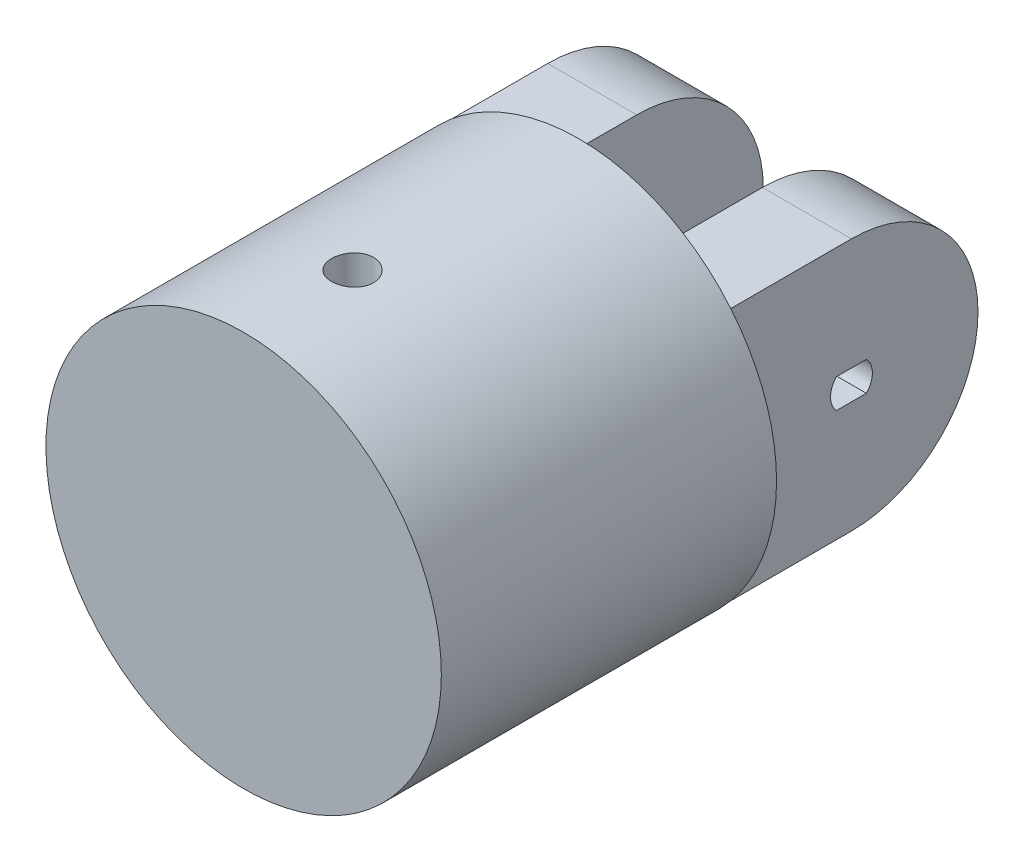
ISO-10303-21;
HEADER;
FILE_DESCRIPTION(('STEP AP214'),'2;1');
FILE_NAME('part.step','',(''),(''),'','','');
FILE_SCHEMA(('AUTOMOTIVE_DESIGN { 1 0 10303 214 1 1 1 1 }'));
ENDSEC;
DATA;
#1=APPLICATION_CONTEXT('core data for automotive mechanical design processes');
#2=APPLICATION_PROTOCOL_DEFINITION('international standard','automotive_design',2000,#1);
#3=PRODUCT_CONTEXT('',#1,'mechanical');
#4=PRODUCT('Part','Part','',(#3));
#5=PRODUCT_RELATED_PRODUCT_CATEGORY('part','',(#4));
#6=PRODUCT_DEFINITION_FORMATION('','',#4);
#7=PRODUCT_DEFINITION_CONTEXT('part definition',#1,'design');
#8=PRODUCT_DEFINITION('design','',#6,#7);
#9=PRODUCT_DEFINITION_SHAPE('','',#8);
#10=(LENGTH_UNIT() NAMED_UNIT(*) SI_UNIT(.MILLI.,.METRE.));
#11=(NAMED_UNIT(*) PLANE_ANGLE_UNIT() SI_UNIT($,.RADIAN.));
#12=(NAMED_UNIT(*) SI_UNIT($,.STERADIAN.) SOLID_ANGLE_UNIT());
#13=UNCERTAINTY_MEASURE_WITH_UNIT(LENGTH_MEASURE(1.E-05),#10,'distance_accuracy_value','');
#14=(GEOMETRIC_REPRESENTATION_CONTEXT(3) GLOBAL_UNCERTAINTY_ASSIGNED_CONTEXT((#13)) GLOBAL_UNIT_ASSIGNED_CONTEXT((#10,
#11,#12)) REPRESENTATION_CONTEXT('',''));
#15=CARTESIAN_POINT('',(0.,0.,0.));
#16=DIRECTION('',(0.,0.,1.));
#17=DIRECTION('',(1.,0.,0.));
#18=AXIS2_PLACEMENT_3D('',#15,#16,#17);
#19=CARTESIAN_POINT('',(7.5,0.,-60.));
#20=DIRECTION('',(1.,0.,0.));
#21=DIRECTION('',(0.,0.,-1.));
#22=AXIS2_PLACEMENT_3D('',#19,#20,#21);
#23=PLANE('',#22);
#24=DIRECTION('',(0.,0.,-1.));
#25=VECTOR('',#24,1.);
#26=CARTESIAN_POINT('',(7.5,-1.75,-60.));
#27=LINE('',#26,#25);
#28=CARTESIAN_POINT('',(7.50000000000001,-1.75,-42.6196428928643));
#29=VERTEX_POINT('',#28);
#30=CARTESIAN_POINT('',(7.5,-1.75,-46.1903571071357));
#31=VERTEX_POINT('',#30);
#32=EDGE_CURVE('E161',#29,#31,#27,.T.);
#33=ORIENTED_EDGE('',*,*,#32,.T.);
#34=CARTESIAN_POINT('',(7.5,0.,-44.405));
#35=DIRECTION('',(1.,0.,0.));
#36=DIRECTION('',(0.,0.,-1.));
#37=AXIS2_PLACEMENT_3D('',#34,#35,#36);
#38=CIRCLE('',#37,2.5);
#39=CARTESIAN_POINT('',(7.50000000000001,1.75,-46.1903571071357));
#40=VERTEX_POINT('',#39);
#41=EDGE_CURVE('E170',#31,#40,#38,.T.);
#42=ORIENTED_EDGE('',*,*,#41,.T.);
#43=DIRECTION('',(0.,0.,1.));
#44=VECTOR('',#43,1.);
#45=CARTESIAN_POINT('',(7.5,1.75,-60.));
#46=LINE('',#45,#44);
#47=CARTESIAN_POINT('',(7.50000000000001,1.75,-42.6196428928643));
#48=VERTEX_POINT('',#47);
#49=EDGE_CURVE('E187',#40,#48,#46,.T.);
#50=ORIENTED_EDGE('',*,*,#49,.T.);
#51=CARTESIAN_POINT('',(7.5,0.,-44.405));
#52=DIRECTION('',(1.,0.,0.));
#53=DIRECTION('',(0.,0.,-1.));
#54=AXIS2_PLACEMENT_3D('',#51,#52,#53);
#55=CIRCLE('',#54,2.5);
#56=EDGE_CURVE('E556',#48,#29,#55,.T.);
#57=ORIENTED_EDGE('',*,*,#56,.T.);
#58=EDGE_LOOP('',(#33,#42,#50,#57));
#59=FACE_BOUND('',#58,.T.);
#60=DIRECTION('',(0.,0.,1.));
#61=VECTOR('',#60,1.);
#62=CARTESIAN_POINT('',(7.5,15.1011299715689,-60.));
#63=LINE('',#62,#61);
#64=CARTESIAN_POINT('',(7.5,15.1011299715689,-44.405));
#65=VERTEX_POINT('',#64);
#66=CARTESIAN_POINT('',(7.5,15.1011299715689,-30.));
#67=VERTEX_POINT('',#66);
#68=EDGE_CURVE('E265',#65,#67,#63,.T.);
#69=ORIENTED_EDGE('',*,*,#68,.F.);
#70=CARTESIAN_POINT('',(7.5,0.,-44.405));
#71=DIRECTION('',(1.,0.,0.));
#72=DIRECTION('',(0.,0.,-1.));
#73=AXIS2_PLACEMENT_3D('',#70,#71,#72);
#74=CIRCLE('',#73,15.1011299715689);
#75=CARTESIAN_POINT('',(7.5,-15.1011299715689,-44.405));
#76=VERTEX_POINT('',#75);
#77=EDGE_CURVE('E208',#65,#76,#74,.F.);
#78=ORIENTED_EDGE('',*,*,#77,.T.);
#79=DIRECTION('',(0.,0.,1.));
#80=VECTOR('',#79,1.);
#81=CARTESIAN_POINT('',(7.5,-15.1011299715689,-60.));
#82=LINE('',#81,#80);
#83=CARTESIAN_POINT('',(7.5,-15.1011299715689,-30.));
#84=VERTEX_POINT('',#83);
#85=EDGE_CURVE('E256',#76,#84,#82,.T.);
#86=ORIENTED_EDGE('',*,*,#85,.T.);
#87=DIRECTION('',(0.,1.,0.));
#88=VECTOR('',#87,1.);
#89=CARTESIAN_POINT('',(7.5,0.,-30.));
#90=LINE('',#89,#88);
#91=EDGE_CURVE('E240',#84,#67,#90,.T.);
#92=ORIENTED_EDGE('',*,*,#91,.T.);
#93=EDGE_LOOP('',(#69,#78,#86,#92));
#94=FACE_BOUND('',#93,.T.);
#95=ADVANCED_FACE('F39',(#59,#94),#23,.F.);
#96=CARTESIAN_POINT('',(18.1230233013641,0.,-60.));
#97=DIRECTION('',(-1.,0.,0.));
#98=DIRECTION('',(0.,0.,1.));
#99=AXIS2_PLACEMENT_3D('',#96,#97,#98);
#100=PLANE('',#99);
#101=DIRECTION('',(0.,0.,-1.));
#102=VECTOR('',#101,1.);
#103=CARTESIAN_POINT('',(18.1230233013641,1.75,-60.));
#104=LINE('',#103,#102);
#105=CARTESIAN_POINT('',(18.1230233013641,1.75,-42.6196428928643));
#106=VERTEX_POINT('',#105);
#107=CARTESIAN_POINT('',(18.1230233013641,1.75,-46.1903571071357));
#108=VERTEX_POINT('',#107);
#109=EDGE_CURVE('E179',#106,#108,#104,.T.);
#110=ORIENTED_EDGE('',*,*,#109,.T.);
#111=CARTESIAN_POINT('',(18.1230233013641,0.,-44.405));
#112=DIRECTION('',(-1.,0.,0.));
#113=DIRECTION('',(0.,0.,1.));
#114=AXIS2_PLACEMENT_3D('',#111,#112,#113);
#115=CIRCLE('',#114,2.5);
#116=CARTESIAN_POINT('',(18.1230233013641,-1.75,-46.1903571071357));
#117=VERTEX_POINT('',#116);
#118=EDGE_CURVE('E167',#108,#117,#115,.T.);
#119=ORIENTED_EDGE('',*,*,#118,.T.);
#120=DIRECTION('',(0.,0.,1.));
#121=VECTOR('',#120,1.);
#122=CARTESIAN_POINT('',(18.1230233013641,-1.75,-60.));
#123=LINE('',#122,#121);
#124=CARTESIAN_POINT('',(18.1230233013641,-1.75,-42.6196428928643));
#125=VERTEX_POINT('',#124);
#126=EDGE_CURVE('E155',#117,#125,#123,.T.);
#127=ORIENTED_EDGE('',*,*,#126,.T.);
#128=CARTESIAN_POINT('',(18.1230233013641,0.,-44.405));
#129=DIRECTION('',(-1.,0.,0.));
#130=DIRECTION('',(0.,0.,1.));
#131=AXIS2_PLACEMENT_3D('',#128,#129,#130);
#132=CIRCLE('',#131,2.5);
#133=EDGE_CURVE('E554',#125,#106,#132,.T.);
#134=ORIENTED_EDGE('',*,*,#133,.T.);
#135=EDGE_LOOP('',(#110,#119,#127,#134));
#136=FACE_BOUND('',#135,.T.);
#137=DIRECTION('',(0.,0.,1.));
#138=VECTOR('',#137,1.);
#139=CARTESIAN_POINT('',(18.1230233013641,-15.1011299715689,-60.));
#140=LINE('',#139,#138);
#141=CARTESIAN_POINT('',(18.1230233013641,-15.1011299715689,-44.405));
#142=VERTEX_POINT('',#141);
#143=CARTESIAN_POINT('',(18.1230233013641,-15.1011299715689,-30.));
#144=VERTEX_POINT('',#143);
#145=EDGE_CURVE('E259',#142,#144,#140,.T.);
#146=ORIENTED_EDGE('',*,*,#145,.F.);
#147=CARTESIAN_POINT('',(18.1230233013641,0.,-44.405));
#148=DIRECTION('',(-1.,0.,0.));
#149=DIRECTION('',(0.,0.,1.));
#150=AXIS2_PLACEMENT_3D('',#147,#148,#149);
#151=CIRCLE('',#150,15.1011299715689);
#152=CARTESIAN_POINT('',(18.1230233013641,15.1011299715689,-44.405));
#153=VERTEX_POINT('',#152);
#154=EDGE_CURVE('E204',#142,#153,#151,.F.);
#155=ORIENTED_EDGE('',*,*,#154,.T.);
#156=DIRECTION('',(0.,0.,1.));
#157=VECTOR('',#156,1.);
#158=CARTESIAN_POINT('',(18.1230233013641,15.1011299715689,-60.));
#159=LINE('',#158,#157);
#160=CARTESIAN_POINT('',(18.1230233013641,15.1011299715689,-30.));
#161=VERTEX_POINT('',#160);
#162=EDGE_CURVE('E262',#153,#161,#159,.T.);
#163=ORIENTED_EDGE('',*,*,#162,.T.);
#164=DIRECTION('',(0.,-1.,0.));
#165=VECTOR('',#164,1.);
#166=CARTESIAN_POINT('',(18.1230233013641,0.,-30.));
#167=LINE('',#166,#165);
#168=EDGE_CURVE('E248',#161,#144,#167,.T.);
#169=ORIENTED_EDGE('',*,*,#168,.T.);
#170=EDGE_LOOP('',(#146,#155,#163,#169));
#171=FACE_BOUND('',#170,.T.);
#172=ADVANCED_FACE('F177',(#136,#171),#100,.F.);
#173=CARTESIAN_POINT('',(-7.5,0.,-60.));
#174=DIRECTION('',(1.,0.,0.));
#175=DIRECTION('',(0.,0.,-1.));
#176=AXIS2_PLACEMENT_3D('',#173,#174,#175);
#177=PLANE('',#176);
#178=CARTESIAN_POINT('',(-7.50000000000001,0.,-44.405));
#179=DIRECTION('',(1.,0.,0.));
#180=DIRECTION('',(0.,0.,-1.));
#181=AXIS2_PLACEMENT_3D('',#178,#179,#180);
#182=CIRCLE('',#181,2.5);
#183=CARTESIAN_POINT('',(-7.49999999999998,-1.75,-46.1903571071357));
#184=VERTEX_POINT('',#183);
#185=CARTESIAN_POINT('',(-7.49999999999998,1.75,-46.1903571071357));
#186=VERTEX_POINT('',#185);
#187=EDGE_CURVE('E181',#184,#186,#182,.T.);
#188=ORIENTED_EDGE('',*,*,#187,.F.);
#189=DIRECTION('',(0.,0.,-1.));
#190=VECTOR('',#189,1.);
#191=CARTESIAN_POINT('',(-7.5,-1.75,-60.));
#192=LINE('',#191,#190);
#193=CARTESIAN_POINT('',(-7.5,-1.75,-42.6196428928643));
#194=VERTEX_POINT('',#193);
#195=EDGE_CURVE('E162',#194,#184,#192,.T.);
#196=ORIENTED_EDGE('',*,*,#195,.F.);
#197=CARTESIAN_POINT('',(-7.50000000000001,0.,-44.405));
#198=DIRECTION('',(1.,0.,0.));
#199=DIRECTION('',(0.,0.,-1.));
#200=AXIS2_PLACEMENT_3D('',#197,#198,#199);
#201=CIRCLE('',#200,2.5);
#202=CARTESIAN_POINT('',(-7.49999999999998,1.75,-42.6196428928643));
#203=VERTEX_POINT('',#202);
#204=EDGE_CURVE('E563',#203,#194,#201,.T.);
#205=ORIENTED_EDGE('',*,*,#204,.F.);
#206=DIRECTION('',(0.,0.,1.));
#207=VECTOR('',#206,1.);
#208=CARTESIAN_POINT('',(-7.5,1.75,-60.));
#209=LINE('',#208,#207);
#210=EDGE_CURVE('E567',#186,#203,#209,.T.);
#211=ORIENTED_EDGE('',*,*,#210,.F.);
#212=EDGE_LOOP('',(#188,#196,#205,#211));
#213=FACE_BOUND('',#212,.T.);
#214=CARTESIAN_POINT('',(-7.5,0.,-44.405));
#215=DIRECTION('',(1.,0.,0.));
#216=DIRECTION('',(0.,0.,-1.));
#217=AXIS2_PLACEMENT_3D('',#214,#215,#216);
#218=CIRCLE('',#217,15.1011299715689);
#219=CARTESIAN_POINT('',(-7.5,15.1011299715689,-44.405));
#220=VERTEX_POINT('',#219);
#221=CARTESIAN_POINT('',(-7.5,-15.1011299715689,-44.405));
#222=VERTEX_POINT('',#221);
#223=EDGE_CURVE('E201',#220,#222,#218,.F.);
#224=ORIENTED_EDGE('',*,*,#223,.F.);
#225=DIRECTION('',(0.,0.,1.));
#226=VECTOR('',#225,1.);
#227=CARTESIAN_POINT('',(-7.5,15.1011299715689,-60.));
#228=LINE('',#227,#226);
#229=CARTESIAN_POINT('',(-7.5,15.1011299715689,-30.));
#230=VERTEX_POINT('',#229);
#231=EDGE_CURVE('E228',#220,#230,#228,.T.);
#232=ORIENTED_EDGE('',*,*,#231,.T.);
#233=DIRECTION('',(0.,1.,0.));
#234=VECTOR('',#233,1.);
#235=CARTESIAN_POINT('',(-7.5,0.,-30.));
#236=LINE('',#235,#234);
#237=CARTESIAN_POINT('',(-7.5,-15.1011299715689,-30.));
#238=VERTEX_POINT('',#237);
#239=EDGE_CURVE('E212',#238,#230,#236,.T.);
#240=ORIENTED_EDGE('',*,*,#239,.F.);
#241=DIRECTION('',(0.,0.,1.));
#242=VECTOR('',#241,1.);
#243=CARTESIAN_POINT('',(-7.5,-15.1011299715689,-60.));
#244=LINE('',#243,#242);
#245=EDGE_CURVE('E237',#222,#238,#244,.T.);
#246=ORIENTED_EDGE('',*,*,#245,.F.);
#247=EDGE_LOOP('',(#224,#232,#240,#246));
#248=FACE_BOUND('',#247,.T.);
#249=ADVANCED_FACE('F337',(#213,#248),#177,.T.);
#250=CARTESIAN_POINT('',(-18.1230233013641,0.,-60.));
#251=DIRECTION('',(-1.,0.,0.));
#252=DIRECTION('',(0.,0.,1.));
#253=AXIS2_PLACEMENT_3D('',#250,#251,#252);
#254=PLANE('',#253);
#255=CARTESIAN_POINT('',(-18.1230233013641,0.,-44.405));
#256=DIRECTION('',(-1.,0.,0.));
#257=DIRECTION('',(0.,0.,1.));
#258=AXIS2_PLACEMENT_3D('',#255,#256,#257);
#259=CIRCLE('',#258,2.5);
#260=CARTESIAN_POINT('',(-18.123023301364,1.75,-46.1903571071357));
#261=VERTEX_POINT('',#260);
#262=CARTESIAN_POINT('',(-18.1230233013641,-1.75,-46.1903571071357));
#263=VERTEX_POINT('',#262);
#264=EDGE_CURVE('E291',#261,#263,#259,.T.);
#265=ORIENTED_EDGE('',*,*,#264,.F.);
#266=DIRECTION('',(0.,0.,-1.));
#267=VECTOR('',#266,1.);
#268=CARTESIAN_POINT('',(-18.1230233013641,1.75,-60.));
#269=LINE('',#268,#267);
#270=CARTESIAN_POINT('',(-18.123023301364,1.75,-42.6196428928643));
#271=VERTEX_POINT('',#270);
#272=EDGE_CURVE('E288',#271,#261,#269,.T.);
#273=ORIENTED_EDGE('',*,*,#272,.F.);
#274=CARTESIAN_POINT('',(-18.1230233013641,0.,-44.405));
#275=DIRECTION('',(-1.,0.,0.));
#276=DIRECTION('',(0.,0.,1.));
#277=AXIS2_PLACEMENT_3D('',#274,#275,#276);
#278=CIRCLE('',#277,2.5);
#279=CARTESIAN_POINT('',(-18.123023301364,-1.75,-42.6196428928643));
#280=VERTEX_POINT('',#279);
#281=EDGE_CURVE('E285',#280,#271,#278,.T.);
#282=ORIENTED_EDGE('',*,*,#281,.F.);
#283=DIRECTION('',(0.,0.,1.));
#284=VECTOR('',#283,1.);
#285=CARTESIAN_POINT('',(-18.1230233013641,-1.75,-60.));
#286=LINE('',#285,#284);
#287=EDGE_CURVE('E282',#263,#280,#286,.T.);
#288=ORIENTED_EDGE('',*,*,#287,.F.);
#289=EDGE_LOOP('',(#265,#273,#282,#288));
#290=FACE_BOUND('',#289,.T.);
#291=CARTESIAN_POINT('',(-18.1230233013641,0.,-44.405));
#292=DIRECTION('',(-1.,0.,0.));
#293=DIRECTION('',(0.,0.,1.));
#294=AXIS2_PLACEMENT_3D('',#291,#292,#293);
#295=CIRCLE('',#294,15.1011299715689);
#296=CARTESIAN_POINT('',(-18.1230233013641,-15.1011299715689,-44.405));
#297=VERTEX_POINT('',#296);
#298=CARTESIAN_POINT('',(-18.1230233013641,15.1011299715689,-44.405));
#299=VERTEX_POINT('',#298);
#300=EDGE_CURVE('E198',#297,#299,#295,.F.);
#301=ORIENTED_EDGE('',*,*,#300,.F.);
#302=DIRECTION('',(0.,0.,1.));
#303=VECTOR('',#302,1.);
#304=CARTESIAN_POINT('',(-18.1230233013641,-15.1011299715689,-60.));
#305=LINE('',#304,#303);
#306=CARTESIAN_POINT('',(-18.1230233013641,-15.1011299715689,-30.));
#307=VERTEX_POINT('',#306);
#308=EDGE_CURVE('E234',#297,#307,#305,.T.);
#309=ORIENTED_EDGE('',*,*,#308,.T.);
#310=DIRECTION('',(0.,-1.,0.));
#311=VECTOR('',#310,1.);
#312=CARTESIAN_POINT('',(-18.1230233013641,0.,-30.));
#313=LINE('',#312,#311);
#314=CARTESIAN_POINT('',(-18.1230233013641,15.1011299715689,-30.));
#315=VERTEX_POINT('',#314);
#316=EDGE_CURVE('E220',#315,#307,#313,.T.);
#317=ORIENTED_EDGE('',*,*,#316,.F.);
#318=DIRECTION('',(0.,0.,1.));
#319=VECTOR('',#318,1.);
#320=CARTESIAN_POINT('',(-18.1230233013641,15.1011299715689,-60.));
#321=LINE('',#320,#319);
#322=EDGE_CURVE('E231',#299,#315,#321,.T.);
#323=ORIENTED_EDGE('',*,*,#322,.F.);
#324=EDGE_LOOP('',(#301,#309,#317,#323));
#325=FACE_BOUND('',#324,.T.);
#326=ADVANCED_FACE('F333',(#290,#325),#254,.T.);
#327=CARTESIAN_POINT('',(0.,0.,-30.));
#328=DIRECTION('',(0.,0.,1.));
#329=DIRECTION('',(1.,0.,0.));
#330=AXIS2_PLACEMENT_3D('',#327,#328,#329);
#331=PLANE('',#330);
#332=DIRECTION('',(1.,0.,0.));
#333=VECTOR('',#332,1.);
#334=CARTESIAN_POINT('',(0.,-15.1011299715689,-30.));
#335=LINE('',#334,#333);
#336=EDGE_CURVE('E216',#307,#238,#335,.T.);
#337=ORIENTED_EDGE('',*,*,#336,.T.);
#338=ORIENTED_EDGE('',*,*,#239,.T.);
#339=DIRECTION('',(-1.,0.,0.));
#340=VECTOR('',#339,1.);
#341=CARTESIAN_POINT('',(0.,15.1011299715689,-30.));
#342=LINE('',#341,#340);
#343=EDGE_CURVE('E224',#230,#315,#342,.T.);
#344=ORIENTED_EDGE('',*,*,#343,.T.);
#345=CARTESIAN_POINT('',(0.,0.,-30.));
#346=DIRECTION('',(0.,0.,1.));
#347=DIRECTION('',(1.,0.,0.));
#348=AXIS2_PLACEMENT_3D('',#345,#346,#347);
#349=CIRCLE('',#348,23.59);
#350=EDGE_CURVE('E269',#161,#315,#349,.T.);
#351=ORIENTED_EDGE('',*,*,#350,.F.);
#352=DIRECTION('',(1.,0.,0.));
#353=VECTOR('',#352,1.);
#354=CARTESIAN_POINT('',(0.,15.1011299715689,-30.));
#355=LINE('',#354,#353);
#356=EDGE_CURVE('E244',#67,#161,#355,.T.);
#357=ORIENTED_EDGE('',*,*,#356,.F.);
#358=ORIENTED_EDGE('',*,*,#91,.F.);
#359=DIRECTION('',(-1.,0.,0.));
#360=VECTOR('',#359,1.);
#361=CARTESIAN_POINT('',(0.,-15.1011299715689,-30.));
#362=LINE('',#361,#360);
#363=EDGE_CURVE('E252',#144,#84,#362,.T.);
#364=ORIENTED_EDGE('',*,*,#363,.F.);
#365=EDGE_CURVE('E275',#307,#144,#349,.T.);
#366=ORIENTED_EDGE('',*,*,#365,.F.);
#367=EDGE_LOOP('',(#337,#338,#344,#351,#357,#358,#364,#366));
#368=FACE_BOUND('',#367,.T.);
#369=ADVANCED_FACE('F336',(#368),#331,.F.);
#370=EDGE_CURVE('E274',#315,#307,#349,.T.);
#371=ORIENTED_EDGE('',*,*,#370,.F.);
#372=ORIENTED_EDGE('',*,*,#316,.T.);
#373=EDGE_LOOP('',(#371,#372));
#374=FACE_BOUND('',#373,.T.);
#375=ADVANCED_FACE('F359',(#374),#331,.F.);
#376=ORIENTED_EDGE('',*,*,#168,.F.);
#377=EDGE_CURVE('E268',#144,#161,#349,.T.);
#378=ORIENTED_EDGE('',*,*,#377,.F.);
#379=EDGE_LOOP('',(#376,#378));
#380=FACE_BOUND('',#379,.T.);
#381=ADVANCED_FACE('F361',(#380),#331,.F.);
#382=CARTESIAN_POINT('',(0.,0.,10.));
#383=DIRECTION('',(0.,0.,-1.));
#384=DIRECTION('',(-1.,0.,0.));
#385=AXIS2_PLACEMENT_3D('',#382,#383,#384);
#386=CYLINDRICAL_SURFACE('',#385,23.59);
#387=CARTESIAN_POINT('',(0.,-23.59,-0.489999999999999));
#388=CARTESIAN_POINT('',(0.140004890382727,-23.5899983030771,-0.49000603969693));
#389=CARTESIAN_POINT('',(0.280101235515981,-23.5887403958274,-0.501800431214244));
#390=CARTESIAN_POINT('',(0.556406756116709,-23.5838433207523,-0.548670742691896));
#391=CARTESIAN_POINT('',(0.69261152926387,-23.5802015594957,-0.583772019164651));
#392=CARTESIAN_POINT('',(0.957092956934866,-23.5709476853588,-0.676220022695312));
#393=CARTESIAN_POINT('',(1.0853744636063,-23.5653367927148,-0.733552975473993));
#394=CARTESIAN_POINT('',(1.33046665616082,-23.552771315274,-0.868809341570436));
#395=CARTESIAN_POINT('',(1.447279548038,-23.545816989654,-0.946728784381125));
#396=CARTESIAN_POINT('',(1.66661511804326,-23.5313118555805,-1.12128191983053));
#397=CARTESIAN_POINT('',(1.76908519934517,-23.5237590029897,-1.2179815397044));
#398=CARTESIAN_POINT('',(1.95637410950071,-23.5089248770597,-1.42720917965773));
#399=CARTESIAN_POINT('',(2.04119210452785,-23.501643616563,-1.53973794703344));
#400=CARTESIAN_POINT('',(2.19095784039705,-23.4881564147091,-1.77776192131046));
#401=CARTESIAN_POINT('',(2.25585757467481,-23.4819530867172,-1.90328749494447));
#402=CARTESIAN_POINT('',(2.36363798842801,-23.4713498936534,-2.16353171314162));
#403=CARTESIAN_POINT('',(2.40651927501024,-23.4669499788572,-2.29825010411844));
#404=CARTESIAN_POINT('',(2.46888865123076,-23.4604705499611,-2.57251690153356));
#405=CARTESIAN_POINT('',(2.48846438567586,-23.4583823443468,-2.71204516838282));
#406=CARTESIAN_POINT('',(2.50393796281383,-23.4567358887997,-2.99242118420334));
#407=CARTESIAN_POINT('',(2.49983649980298,-23.4571775646821,-3.13326889436311));
#408=CARTESIAN_POINT('',(2.46814427950293,-23.4605330256352,-3.41168003730262));
#409=CARTESIAN_POINT('',(2.44064940226408,-23.4634367197315,-3.54925452309887));
#410=CARTESIAN_POINT('',(2.3631001092226,-23.4713732901132,-3.81782537038899));
#411=CARTESIAN_POINT('',(2.31304535499427,-23.4764061983395,-3.94882163316874));
#412=CARTESIAN_POINT('',(2.19169195639642,-23.4880456955699,-4.20081931310333));
#413=CARTESIAN_POINT('',(2.12035096524796,-23.4946554161757,-4.32180018698026));
#414=CARTESIAN_POINT('',(1.95848059921139,-23.5087011989002,-4.55010801848893));
#415=CARTESIAN_POINT('',(1.86795059325973,-23.5161372881916,-4.65743452688772));
#416=CARTESIAN_POINT('',(1.66973740575721,-23.5310428996824,-4.85594403960406));
#417=CARTESIAN_POINT('',(1.56197145460676,-23.538512404975,-4.94704441956521));
#418=CARTESIAN_POINT('',(1.3326323311139,-23.5526085089759,-5.10987462840384));
#419=CARTESIAN_POINT('',(1.21105914024982,-23.5592351065534,-5.18160443129632));
#420=CARTESIAN_POINT('',(0.95749788958243,-23.5709013286536,-5.30365476311559));
#421=CARTESIAN_POINT('',(0.825507692564154,-23.5759406264525,-5.35397088507729));
#422=CARTESIAN_POINT('',(0.554887088841686,-23.583861220576,-5.43170391119958));
#423=CARTESIAN_POINT('',(0.416256905405359,-23.5867425894063,-5.45912158474396));
#424=CARTESIAN_POINT('',(0.137006812514261,-23.5900133370954,-5.49017411128186));
#425=CARTESIAN_POINT('',(-0.00360028917354425,-23.5904146578676,-5.49392293627816));
#426=CARTESIAN_POINT('',(-0.283440751422993,-23.5887121615328,-5.47783100808127));
#427=CARTESIAN_POINT('',(-0.422674132839351,-23.5866083825154,-5.45799061355793));
#428=CARTESIAN_POINT('',(-0.695484265843108,-23.5801396699159,-5.39537802601103));
#429=CARTESIAN_POINT('',(-0.82907345030202,-23.5757800202398,-5.3526594122884));
#430=CARTESIAN_POINT('',(-1.08719009199438,-23.5652884237549,-5.24555821321705));
#431=CARTESIAN_POINT('',(-1.21171732245822,-23.5591564326133,-5.18117508595433));
#432=CARTESIAN_POINT('',(-1.44868911728913,-23.5457757711934,-5.0322913247812));
#433=CARTESIAN_POINT('',(-1.5610865587743,-23.5385229945229,-4.94771606251431));
#434=CARTESIAN_POINT('',(-1.77013069103516,-23.52372718167,-4.76095550181403));
#435=CARTESIAN_POINT('',(-1.86677693664698,-23.5161841372913,-4.6587697058356));
#436=CARTESIAN_POINT('',(-2.04197287593517,-23.5016218005983,-4.43919039930669));
#437=CARTESIAN_POINT('',(-2.12044760211723,-23.4946047560305,-4.32173690413937));
#438=CARTESIAN_POINT('',(-2.25655697915346,-23.4819237546767,-4.07525107588106));
#439=CARTESIAN_POINT('',(-2.31419194505344,-23.4762597774361,-3.94621891786773));
#440=CARTESIAN_POINT('',(-2.40686115244347,-23.4669405565708,-3.68049226779922));
#441=CARTESIAN_POINT('',(-2.44193948508609,-23.4632813962425,-3.54381329513695));
#442=CARTESIAN_POINT('',(-2.48864252138218,-23.4583741704025,-3.26646441598402));
#443=CARTESIAN_POINT('',(-2.50026798822697,-23.4571260264327,-3.12579463951115));
#444=CARTESIAN_POINT('',(-2.49972395442829,-23.4571839502349,-2.8452024982952));
#445=CARTESIAN_POINT('',(-2.48767221595611,-23.4584773771247,-2.70527988777961));
#446=CARTESIAN_POINT('',(-2.44036333007009,-23.4634457046064,-2.42945940858843));
#447=CARTESIAN_POINT('',(-2.40510616101156,-23.4671206074198,-2.293561543667));
#448=CARTESIAN_POINT('',(-2.31242071265327,-23.4764342239078,-2.02965235169496));
#449=CARTESIAN_POINT('',(-2.25499638901096,-23.4820725871918,-1.90163962229053));
#450=CARTESIAN_POINT('',(-2.11961864177243,-23.4946785069669,-1.65705012653464));
#451=CARTESIAN_POINT('',(-2.04166525062717,-23.5016460613569,-1.54047334210642));
#452=CARTESIAN_POINT('',(-1.86700081845346,-23.5161668347073,-1.32146155094034));
#453=CARTESIAN_POINT('',(-1.77020196065382,-23.5237226921116,-1.21909675155487));
#454=CARTESIAN_POINT('',(-1.56077124206543,-23.538544757639,-1.03201366539061));
#455=CARTESIAN_POINT('',(-1.44813560849441,-23.5458108962116,-0.947299595500965));
#456=CARTESIAN_POINT('',(-1.20987998501282,-23.5592562744924,-0.797732482694004));
#457=CARTESIAN_POINT('',(-1.08422463280158,-23.5654324240323,-0.732935532387384));
#458=CARTESIAN_POINT('',(-0.823829412681912,-23.5759690180188,-0.625448967407829));
#459=CARTESIAN_POINT('',(-0.689099898452414,-23.5803314924243,-0.582734623623249));
#460=CARTESIAN_POINT('',(-0.461351179347137,-23.5856627304559,-0.531183987042706));
#461=CARTESIAN_POINT('',(-0.369783882248669,-23.5872815484788,-0.515761329659117));
#462=CARTESIAN_POINT('',(-0.185491103341336,-23.5894507428818,-0.495167359685417));
#463=CARTESIAN_POINT('',(-0.0927656270625256,-23.5900011243616,-0.489995998166409));
#464=CARTESIAN_POINT('',(0.,-23.59,-0.489999999999999));
#465=B_SPLINE_CURVE_WITH_KNOTS('',3,(#387,#388,#389,#390,#391,#392,#393,#394,#395,#396,#397,
#398,#399,#400,#401,#402,#403,#404,#405,#406,#407,#408,#409,#410,#411,#412,#413,#414,#415,#416,
#417,#418,#419,#420,#421,#422,#423,#424,#425,#426,#427,#428,#429,#430,#431,#432,#433,#434,#435,
#436,#437,#438,#439,#440,#441,#442,#443,#444,#445,#446,#447,#448,#449,#450,#451,#452,#453,#454,
#455,#456,#457,#458,#459,#460,#461,#462,#463,#464),.UNSPECIFIED.,.T.,.F.,(4,2,2,2,2,2,2,2,2,2,2,
2,2,2,2,2,2,2,2,2,2,2,2,2,2,2,2,2,2,2,2,2,2,2,2,2,2,2,4),(0.,0.41967590487986,0.839809142071956,
1.25968248839799,1.67947491298238,2.10076854982229,2.52208208267318,2.94440322328858,
3.36671271876888,3.78742897392592,4.2081328923083,4.62712077768863,5.04611494860777,
5.46594828694184,5.88579543435547,6.30772288072299,6.72965089308984,7.15166569688249,
7.57366632048222,7.99363333555401,8.41359396518424,8.8325753478515,9.25156721165667,
9.67213228156076,10.0927092355103,10.5149915581614,10.9372674966777,11.3587154885586,
11.7801497656706,12.1994932813853,12.6188371882399,13.0381062990891,13.4573747471904,
13.878645816124,14.3000174147048,14.7225650736196,15.1446385137549,15.4227122595514,
15.7007846781132),.UNSPECIFIED.);
#466=CARTESIAN_POINT('',(0.,-23.59,-0.489999999999999));
#467=VERTEX_POINT('',#466);
#468=EDGE_CURVE('E11',#467,#467,#465,.T.);
#469=ORIENTED_EDGE('',*,*,#468,.T.);
#470=EDGE_LOOP('',(#469));
#471=FACE_BOUND('',#470,.T.);
#472=CARTESIAN_POINT('',(0.,23.59,-0.489999999999999));
#473=CARTESIAN_POINT('',(-0.140004890382727,23.5899983030771,-0.49000603969693));
#474=CARTESIAN_POINT('',(-0.280101235515981,23.5887403958274,-0.501800431214244));
#475=CARTESIAN_POINT('',(-0.556406756116709,23.5838433207523,-0.548670742691896));
#476=CARTESIAN_POINT('',(-0.69261152926387,23.5802015594957,-0.583772019164651));
#477=CARTESIAN_POINT('',(-0.957092956934866,23.5709476853588,-0.676220022695312));
#478=CARTESIAN_POINT('',(-1.0853744636063,23.5653367927148,-0.733552975473993));
#479=CARTESIAN_POINT('',(-1.33046665616082,23.552771315274,-0.868809341570436));
#480=CARTESIAN_POINT('',(-1.447279548038,23.545816989654,-0.946728784381125));
#481=CARTESIAN_POINT('',(-1.66661511804326,23.5313118555805,-1.12128191983053));
#482=CARTESIAN_POINT('',(-1.76908519934517,23.5237590029897,-1.2179815397044));
#483=CARTESIAN_POINT('',(-1.95637410950071,23.5089248770597,-1.42720917965773));
#484=CARTESIAN_POINT('',(-2.04119210452785,23.501643616563,-1.53973794703344));
#485=CARTESIAN_POINT('',(-2.19095784039705,23.4881564147091,-1.77776192131046));
#486=CARTESIAN_POINT('',(-2.25585757467481,23.4819530867172,-1.90328749494447));
#487=CARTESIAN_POINT('',(-2.36363798842801,23.4713498936534,-2.16353171314162));
#488=CARTESIAN_POINT('',(-2.40651927501024,23.4669499788572,-2.29825010411844));
#489=CARTESIAN_POINT('',(-2.46888865123076,23.4604705499611,-2.57251690153356));
#490=CARTESIAN_POINT('',(-2.48846438567586,23.4583823443468,-2.71204516838282));
#491=CARTESIAN_POINT('',(-2.50393796281383,23.4567358887997,-2.99242118420334));
#492=CARTESIAN_POINT('',(-2.49983649980298,23.4571775646821,-3.13326889436311));
#493=CARTESIAN_POINT('',(-2.46814427950293,23.4605330256352,-3.41168003730262));
#494=CARTESIAN_POINT('',(-2.44064940226408,23.4634367197315,-3.54925452309887));
#495=CARTESIAN_POINT('',(-2.3631001092226,23.4713732901132,-3.81782537038899));
#496=CARTESIAN_POINT('',(-2.31304535499427,23.4764061983395,-3.94882163316874));
#497=CARTESIAN_POINT('',(-2.19169195639642,23.4880456955699,-4.20081931310333));
#498=CARTESIAN_POINT('',(-2.12035096524796,23.4946554161757,-4.32180018698026));
#499=CARTESIAN_POINT('',(-1.95848059921139,23.5087011989002,-4.55010801848893));
#500=CARTESIAN_POINT('',(-1.86795059325973,23.5161372881916,-4.65743452688772));
#501=CARTESIAN_POINT('',(-1.66973740575721,23.5310428996824,-4.85594403960406));
#502=CARTESIAN_POINT('',(-1.56197145460676,23.538512404975,-4.94704441956521));
#503=CARTESIAN_POINT('',(-1.3326323311139,23.5526085089759,-5.10987462840384));
#504=CARTESIAN_POINT('',(-1.21105914024982,23.5592351065534,-5.18160443129632));
#505=CARTESIAN_POINT('',(-0.95749788958243,23.5709013286536,-5.30365476311559));
#506=CARTESIAN_POINT('',(-0.825507692564154,23.5759406264525,-5.35397088507729));
#507=CARTESIAN_POINT('',(-0.554887088841686,23.583861220576,-5.43170391119958));
#508=CARTESIAN_POINT('',(-0.416256905405359,23.5867425894063,-5.45912158474396));
#509=CARTESIAN_POINT('',(-0.137006812514261,23.5900133370954,-5.49017411128186));
#510=CARTESIAN_POINT('',(0.00360028917354425,23.5904146578676,-5.49392293627816));
#511=CARTESIAN_POINT('',(0.283440751422993,23.5887121615328,-5.47783100808127));
#512=CARTESIAN_POINT('',(0.422674132839351,23.5866083825154,-5.45799061355793));
#513=CARTESIAN_POINT('',(0.695484265843108,23.5801396699159,-5.39537802601103));
#514=CARTESIAN_POINT('',(0.82907345030202,23.5757800202398,-5.3526594122884));
#515=CARTESIAN_POINT('',(1.08719009199438,23.5652884237549,-5.24555821321705));
#516=CARTESIAN_POINT('',(1.21171732245822,23.5591564326133,-5.18117508595433));
#517=CARTESIAN_POINT('',(1.44868911728913,23.5457757711934,-5.0322913247812));
#518=CARTESIAN_POINT('',(1.5610865587743,23.5385229945229,-4.94771606251431));
#519=CARTESIAN_POINT('',(1.77013069103516,23.52372718167,-4.76095550181403));
#520=CARTESIAN_POINT('',(1.86677693664698,23.5161841372913,-4.6587697058356));
#521=CARTESIAN_POINT('',(2.04197287593517,23.5016218005983,-4.43919039930669));
#522=CARTESIAN_POINT('',(2.12044760211723,23.4946047560305,-4.32173690413937));
#523=CARTESIAN_POINT('',(2.25655697915346,23.4819237546767,-4.07525107588106));
#524=CARTESIAN_POINT('',(2.31419194505344,23.4762597774361,-3.94621891786773));
#525=CARTESIAN_POINT('',(2.40686115244347,23.4669405565708,-3.68049226779922));
#526=CARTESIAN_POINT('',(2.44193948508609,23.4632813962425,-3.54381329513695));
#527=CARTESIAN_POINT('',(2.48864252138218,23.4583741704025,-3.26646441598402));
#528=CARTESIAN_POINT('',(2.50026798822697,23.4571260264327,-3.12579463951115));
#529=CARTESIAN_POINT('',(2.49972395442829,23.4571839502349,-2.8452024982952));
#530=CARTESIAN_POINT('',(2.48767221595611,23.4584773771247,-2.70527988777961));
#531=CARTESIAN_POINT('',(2.44036333007009,23.4634457046064,-2.42945940858843));
#532=CARTESIAN_POINT('',(2.40510616101156,23.4671206074198,-2.293561543667));
#533=CARTESIAN_POINT('',(2.31242071265327,23.4764342239078,-2.02965235169496));
#534=CARTESIAN_POINT('',(2.25499638901096,23.4820725871918,-1.90163962229053));
#535=CARTESIAN_POINT('',(2.11961864177243,23.4946785069669,-1.65705012653464));
#536=CARTESIAN_POINT('',(2.04166525062717,23.5016460613569,-1.54047334210642));
#537=CARTESIAN_POINT('',(1.86700081845346,23.5161668347073,-1.32146155094034));
#538=CARTESIAN_POINT('',(1.77020196065382,23.5237226921116,-1.21909675155487));
#539=CARTESIAN_POINT('',(1.56077124206543,23.538544757639,-1.03201366539061));
#540=CARTESIAN_POINT('',(1.44813560849441,23.5458108962116,-0.947299595500965));
#541=CARTESIAN_POINT('',(1.20987998501282,23.5592562744924,-0.797732482694004));
#542=CARTESIAN_POINT('',(1.08422463280158,23.5654324240323,-0.732935532387384));
#543=CARTESIAN_POINT('',(0.823829412681912,23.5759690180188,-0.625448967407829));
#544=CARTESIAN_POINT('',(0.689099898452414,23.5803314924243,-0.582734623623249));
#545=CARTESIAN_POINT('',(0.461351179347137,23.5856627304559,-0.531183987042706));
#546=CARTESIAN_POINT('',(0.369783882248669,23.5872815484788,-0.515761329659117));
#547=CARTESIAN_POINT('',(0.185491103341336,23.5894507428818,-0.495167359685417));
#548=CARTESIAN_POINT('',(0.0927656270625256,23.5900011243616,-0.489995998166409));
#549=CARTESIAN_POINT('',(0.,23.59,-0.489999999999999));
#550=B_SPLINE_CURVE_WITH_KNOTS('',3,(#472,#473,#474,#475,#476,#477,#478,#479,#480,#481,#482,
#483,#484,#485,#486,#487,#488,#489,#490,#491,#492,#493,#494,#495,#496,#497,#498,#499,#500,#501,
#502,#503,#504,#505,#506,#507,#508,#509,#510,#511,#512,#513,#514,#515,#516,#517,#518,#519,#520,
#521,#522,#523,#524,#525,#526,#527,#528,#529,#530,#531,#532,#533,#534,#535,#536,#537,#538,#539,
#540,#541,#542,#543,#544,#545,#546,#547,#548,#549),.UNSPECIFIED.,.T.,.F.,(4,2,2,2,2,2,2,2,2,2,2,
2,2,2,2,2,2,2,2,2,2,2,2,2,2,2,2,2,2,2,2,2,2,2,2,2,2,2,4),(0.,0.41967590487986,0.839809142071956,
1.25968248839799,1.67947491298238,2.10076854982229,2.52208208267318,2.94440322328858,
3.36671271876888,3.78742897392592,4.2081328923083,4.62712077768863,5.04611494860777,
5.46594828694184,5.88579543435547,6.30772288072299,6.72965089308984,7.15166569688249,
7.57366632048222,7.99363333555401,8.41359396518424,8.8325753478515,9.25156721165667,
9.67213228156076,10.0927092355103,10.5149915581614,10.9372674966777,11.3587154885586,
11.7801497656706,12.1994932813853,12.6188371882399,13.0381062990891,13.4573747471904,
13.878645816124,14.3000174147048,14.7225650736196,15.1446385137549,15.4227122595514,
15.7007846781132),.UNSPECIFIED.);
#551=CARTESIAN_POINT('',(0.,23.59,-0.489999999999999));
#552=VERTEX_POINT('',#551);
#553=EDGE_CURVE('E53',#552,#552,#550,.T.);
#554=ORIENTED_EDGE('',*,*,#553,.T.);
#555=EDGE_LOOP('',(#554));
#556=FACE_BOUND('',#555,.T.);
#557=CARTESIAN_POINT('',(0.,0.,10.));
#558=DIRECTION('',(0.,0.,1.));
#559=DIRECTION('',(1.,0.,0.));
#560=AXIS2_PLACEMENT_3D('',#557,#558,#559);
#561=CIRCLE('',#560,23.59);
#562=CARTESIAN_POINT('',(23.59,0.,10.));
#563=VERTEX_POINT('',#562);
#564=EDGE_CURVE('E273',#563,#563,#561,.T.);
#565=ORIENTED_EDGE('',*,*,#564,.F.);
#566=EDGE_LOOP('',(#565));
#567=FACE_BOUND('',#566,.T.);
#568=ORIENTED_EDGE('',*,*,#350,.T.);
#569=ORIENTED_EDGE('',*,*,#370,.T.);
#570=ORIENTED_EDGE('',*,*,#365,.T.);
#571=ORIENTED_EDGE('',*,*,#377,.T.);
#572=EDGE_LOOP('',(#568,#569,#570,#571));
#573=FACE_BOUND('',#572,.T.);
#574=ADVANCED_FACE('F41',(#471,#556,#567,#573),#386,.T.);
#575=CARTESIAN_POINT('',(0.,0.,10.));
#576=DIRECTION('',(0.,0.,1.));
#577=DIRECTION('',(1.,0.,0.));
#578=AXIS2_PLACEMENT_3D('',#575,#576,#577);
#579=PLANE('',#578);
#580=ORIENTED_EDGE('',*,*,#564,.T.);
#581=EDGE_LOOP('',(#580));
#582=FACE_BOUND('',#581,.T.);
#583=ADVANCED_FACE('F354',(#582),#579,.T.);
#584=CARTESIAN_POINT('',(0.,15.1011299715689,-60.));
#585=DIRECTION('',(0.,-1.,0.));
#586=DIRECTION('',(0.,0.,-1.));
#587=AXIS2_PLACEMENT_3D('',#584,#585,#586);
#588=PLANE('',#587);
#589=ORIENTED_EDGE('',*,*,#162,.F.);
#590=DIRECTION('',(-1.,0.,0.));
#591=VECTOR('',#590,1.);
#592=CARTESIAN_POINT('',(41.2819766986359,15.1011299715689,-44.405));
#593=LINE('',#592,#591);
#594=EDGE_CURVE('E185',#153,#65,#593,.T.);
#595=ORIENTED_EDGE('',*,*,#594,.T.);
#596=ORIENTED_EDGE('',*,*,#68,.T.);
#597=ORIENTED_EDGE('',*,*,#356,.T.);
#598=EDGE_LOOP('',(#589,#595,#596,#597));
#599=FACE_BOUND('',#598,.T.);
#600=ADVANCED_FACE('F348',(#599),#588,.F.);
#601=CARTESIAN_POINT('',(0.,-15.1011299715689,-60.));
#602=DIRECTION('',(0.,1.,0.));
#603=DIRECTION('',(0.,0.,1.));
#604=AXIS2_PLACEMENT_3D('',#601,#602,#603);
#605=PLANE('',#604);
#606=ORIENTED_EDGE('',*,*,#85,.F.);
#607=DIRECTION('',(-1.,0.,0.));
#608=VECTOR('',#607,1.);
#609=CARTESIAN_POINT('',(41.2819766986359,-15.1011299715689,-44.405));
#610=LINE('',#609,#608);
#611=EDGE_CURVE('E194',#142,#76,#610,.T.);
#612=ORIENTED_EDGE('',*,*,#611,.F.);
#613=ORIENTED_EDGE('',*,*,#145,.T.);
#614=ORIENTED_EDGE('',*,*,#363,.T.);
#615=EDGE_LOOP('',(#606,#612,#613,#614));
#616=FACE_BOUND('',#615,.T.);
#617=ADVANCED_FACE('F341',(#616),#605,.F.);
#618=CARTESIAN_POINT('',(0.,-15.1011299715689,-60.));
#619=DIRECTION('',(0.,-1.,0.));
#620=DIRECTION('',(0.,0.,-1.));
#621=AXIS2_PLACEMENT_3D('',#618,#619,#620);
#622=PLANE('',#621);
#623=EDGE_CURVE('E191',#222,#297,#610,.T.);
#624=ORIENTED_EDGE('',*,*,#623,.F.);
#625=ORIENTED_EDGE('',*,*,#245,.T.);
#626=ORIENTED_EDGE('',*,*,#336,.F.);
#627=ORIENTED_EDGE('',*,*,#308,.F.);
#628=EDGE_LOOP('',(#624,#625,#626,#627));
#629=FACE_BOUND('',#628,.T.);
#630=ADVANCED_FACE('F331',(#629),#622,.T.);
#631=CARTESIAN_POINT('',(0.,15.1011299715689,-60.));
#632=DIRECTION('',(0.,1.,0.));
#633=DIRECTION('',(0.,0.,1.));
#634=AXIS2_PLACEMENT_3D('',#631,#632,#633);
#635=PLANE('',#634);
#636=DIRECTION('',(1.,0.,0.));
#637=VECTOR('',#636,1.);
#638=CARTESIAN_POINT('',(0.,15.1011299715689,-44.405));
#639=LINE('',#638,#637);
#640=EDGE_CURVE('E279',#299,#220,#639,.T.);
#641=ORIENTED_EDGE('',*,*,#640,.F.);
#642=ORIENTED_EDGE('',*,*,#322,.T.);
#643=ORIENTED_EDGE('',*,*,#343,.F.);
#644=ORIENTED_EDGE('',*,*,#231,.F.);
#645=EDGE_LOOP('',(#641,#642,#643,#644));
#646=FACE_BOUND('',#645,.T.);
#647=ADVANCED_FACE('F327',(#646),#635,.T.);
#648=CARTESIAN_POINT('',(41.2819766986359,0.,-44.405));
#649=DIRECTION('',(-1.,0.,0.));
#650=DIRECTION('',(0.,0.,1.));
#651=AXIS2_PLACEMENT_3D('',#648,#649,#650);
#652=CYLINDRICAL_SURFACE('',#651,15.1011299715689);
#653=ORIENTED_EDGE('',*,*,#223,.T.);
#654=ORIENTED_EDGE('',*,*,#623,.T.);
#655=ORIENTED_EDGE('',*,*,#300,.T.);
#656=ORIENTED_EDGE('',*,*,#640,.T.);
#657=EDGE_LOOP('',(#653,#654,#655,#656));
#658=FACE_BOUND('',#657,.T.);
#659=ADVANCED_FACE('F324',(#658),#652,.T.);
#660=ORIENTED_EDGE('',*,*,#594,.F.);
#661=ORIENTED_EDGE('',*,*,#154,.F.);
#662=ORIENTED_EDGE('',*,*,#611,.T.);
#663=ORIENTED_EDGE('',*,*,#77,.F.);
#664=EDGE_LOOP('',(#660,#661,#662,#663));
#665=FACE_BOUND('',#664,.T.);
#666=ADVANCED_FACE('F319',(#665),#652,.T.);
#667=CARTESIAN_POINT('',(61.2819766986359,-1.75,-46.1903571071357));
#668=DIRECTION('',(0.,-1.,0.));
#669=DIRECTION('',(0.,0.,-1.));
#670=AXIS2_PLACEMENT_3D('',#667,#668,#669);
#671=PLANE('',#670);
#672=ORIENTED_EDGE('',*,*,#195,.T.);
#673=DIRECTION('',(-1.,0.,0.));
#674=VECTOR('',#673,1.);
#675=CARTESIAN_POINT('',(61.2819766986359,-1.75,-46.1903571071357));
#676=LINE('',#675,#674);
#677=EDGE_CURVE('E174',#184,#263,#676,.T.);
#678=ORIENTED_EDGE('',*,*,#677,.T.);
#679=ORIENTED_EDGE('',*,*,#287,.T.);
#680=DIRECTION('',(-1.,0.,0.));
#681=VECTOR('',#680,1.);
#682=CARTESIAN_POINT('',(61.2819766986359,-1.75,-42.6196428928643));
#683=LINE('',#682,#681);
#684=EDGE_CURVE('E173',#194,#280,#683,.T.);
#685=ORIENTED_EDGE('',*,*,#684,.F.);
#686=EDGE_LOOP('',(#672,#678,#679,#685));
#687=FACE_BOUND('',#686,.T.);
#688=ADVANCED_FACE('F314',(#687),#671,.F.);
#689=CARTESIAN_POINT('',(61.2819766986359,0.,-44.405));
#690=DIRECTION('',(-1.,0.,0.));
#691=DIRECTION('',(0.,0.,1.));
#692=AXIS2_PLACEMENT_3D('',#689,#690,#691);
#693=CYLINDRICAL_SURFACE('',#692,2.5);
#694=ORIENTED_EDGE('',*,*,#204,.T.);
#695=ORIENTED_EDGE('',*,*,#684,.T.);
#696=ORIENTED_EDGE('',*,*,#281,.T.);
#697=DIRECTION('',(-1.,0.,0.));
#698=VECTOR('',#697,1.);
#699=CARTESIAN_POINT('',(61.2819766986359,1.75,-42.6196428928643));
#700=LINE('',#699,#698);
#701=EDGE_CURVE('E560',#203,#271,#700,.T.);
#702=ORIENTED_EDGE('',*,*,#701,.F.);
#703=EDGE_LOOP('',(#694,#695,#696,#702));
#704=FACE_BOUND('',#703,.T.);
#705=ADVANCED_FACE('F309',(#704),#693,.F.);
#706=CARTESIAN_POINT('',(61.2819766986359,1.75,-46.1903571071357));
#707=DIRECTION('',(0.,1.,0.));
#708=DIRECTION('',(0.,0.,1.));
#709=AXIS2_PLACEMENT_3D('',#706,#707,#708);
#710=PLANE('',#709);
#711=ORIENTED_EDGE('',*,*,#210,.T.);
#712=ORIENTED_EDGE('',*,*,#701,.T.);
#713=ORIENTED_EDGE('',*,*,#272,.T.);
#714=DIRECTION('',(-1.,0.,0.));
#715=VECTOR('',#714,1.);
#716=CARTESIAN_POINT('',(61.2819766986359,1.75,-46.1903571071357));
#717=LINE('',#716,#715);
#718=EDGE_CURVE('E559',#186,#261,#717,.T.);
#719=ORIENTED_EDGE('',*,*,#718,.F.);
#720=EDGE_LOOP('',(#711,#712,#713,#719));
#721=FACE_BOUND('',#720,.T.);
#722=ADVANCED_FACE('F304',(#721),#710,.F.);
#723=CARTESIAN_POINT('',(61.2819766986359,0.,-44.405));
#724=DIRECTION('',(-1.,0.,0.));
#725=DIRECTION('',(0.,0.,1.));
#726=AXIS2_PLACEMENT_3D('',#723,#724,#725);
#727=CYLINDRICAL_SURFACE('',#726,2.5);
#728=ORIENTED_EDGE('',*,*,#187,.T.);
#729=ORIENTED_EDGE('',*,*,#718,.T.);
#730=ORIENTED_EDGE('',*,*,#264,.T.);
#731=ORIENTED_EDGE('',*,*,#677,.F.);
#732=EDGE_LOOP('',(#728,#729,#730,#731));
#733=FACE_BOUND('',#732,.T.);
#734=ADVANCED_FACE('F308',(#733),#727,.F.);
#735=EDGE_CURVE('E60',#117,#31,#676,.T.);
#736=ORIENTED_EDGE('',*,*,#735,.F.);
#737=ORIENTED_EDGE('',*,*,#118,.F.);
#738=EDGE_CURVE('E577',#108,#40,#717,.T.);
#739=ORIENTED_EDGE('',*,*,#738,.T.);
#740=ORIENTED_EDGE('',*,*,#41,.F.);
#741=EDGE_LOOP('',(#736,#737,#739,#740));
#742=FACE_BOUND('',#741,.T.);
#743=ADVANCED_FACE('F165',(#742),#727,.F.);
#744=ORIENTED_EDGE('',*,*,#738,.F.);
#745=ORIENTED_EDGE('',*,*,#109,.F.);
#746=EDGE_CURVE('E553',#106,#48,#700,.T.);
#747=ORIENTED_EDGE('',*,*,#746,.T.);
#748=ORIENTED_EDGE('',*,*,#49,.F.);
#749=EDGE_LOOP('',(#744,#745,#747,#748));
#750=FACE_BOUND('',#749,.T.);
#751=ADVANCED_FACE('F311',(#750),#710,.F.);
#752=ORIENTED_EDGE('',*,*,#746,.F.);
#753=ORIENTED_EDGE('',*,*,#133,.F.);
#754=EDGE_CURVE('E65',#125,#29,#683,.T.);
#755=ORIENTED_EDGE('',*,*,#754,.T.);
#756=ORIENTED_EDGE('',*,*,#56,.F.);
#757=EDGE_LOOP('',(#752,#753,#755,#756));
#758=FACE_BOUND('',#757,.T.);
#759=ADVANCED_FACE('F316',(#758),#693,.F.);
#760=ORIENTED_EDGE('',*,*,#754,.F.);
#761=ORIENTED_EDGE('',*,*,#126,.F.);
#762=ORIENTED_EDGE('',*,*,#735,.T.);
#763=ORIENTED_EDGE('',*,*,#32,.F.);
#764=EDGE_LOOP('',(#760,#761,#762,#763));
#765=FACE_BOUND('',#764,.T.);
#766=ADVANCED_FACE('F156',(#765),#671,.F.);
#767=CARTESIAN_POINT('',(0.,-23.59,-2.99));
#768=DIRECTION('',(0.,1.,0.));
#769=DIRECTION('',(0.,0.,1.));
#770=AXIS2_PLACEMENT_3D('',#767,#768,#769);
#771=CYLINDRICAL_SURFACE('',#770,2.5);
#772=ORIENTED_EDGE('',*,*,#553,.F.);
#773=EDGE_LOOP('',(#772));
#774=FACE_BOUND('',#773,.T.);
#775=ORIENTED_EDGE('',*,*,#468,.F.);
#776=EDGE_LOOP('',(#775));
#777=FACE_BOUND('',#776,.T.);
#778=ADVANCED_FACE('F299',(#774,#777),#771,.F.);
#779=CLOSED_SHELL('',(#95,#172,#249,#326,#369,#375,#381,#574,#583,#600,#617,#630,#647,#659,#666,
#688,#705,#722,#734,#743,#751,#759,#766,#778));
#780=MANIFOLD_SOLID_BREP('B2',#779);
#781=ADVANCED_BREP_SHAPE_REPRESENTATION('',(#18,#780),#14);
#782=SHAPE_DEFINITION_REPRESENTATION(#9,#781);
ENDSEC;
END-ISO-10303-21;
